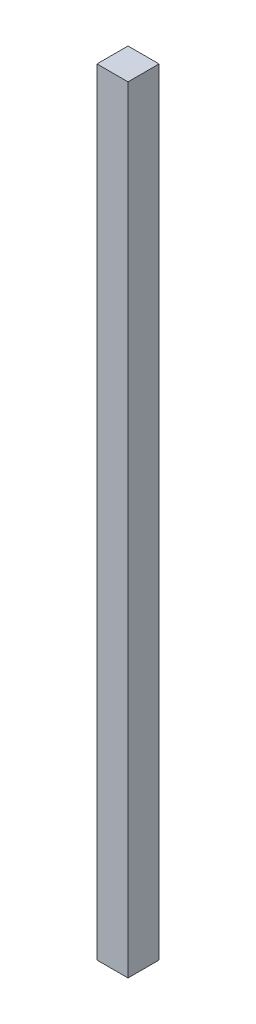
ISO-10303-21;
HEADER;
FILE_DESCRIPTION(('STEP AP214'),'2;1');
FILE_NAME('part.step','',(''),(''),'','','');
FILE_SCHEMA(('AUTOMOTIVE_DESIGN { 1 0 10303 214 1 1 1 1 }'));
ENDSEC;
DATA;
#1=APPLICATION_CONTEXT('core data for automotive mechanical design processes');
#2=APPLICATION_PROTOCOL_DEFINITION('international standard','automotive_design',2000,#1);
#3=PRODUCT_CONTEXT('',#1,'mechanical');
#4=PRODUCT('Part','Part','',(#3));
#5=PRODUCT_RELATED_PRODUCT_CATEGORY('part','',(#4));
#6=PRODUCT_DEFINITION_FORMATION('','',#4);
#7=PRODUCT_DEFINITION_CONTEXT('part definition',#1,'design');
#8=PRODUCT_DEFINITION('design','',#6,#7);
#9=PRODUCT_DEFINITION_SHAPE('','',#8);
#10=(LENGTH_UNIT() NAMED_UNIT(*) SI_UNIT(.MILLI.,.METRE.));
#11=(NAMED_UNIT(*) PLANE_ANGLE_UNIT() SI_UNIT($,.RADIAN.));
#12=(NAMED_UNIT(*) SI_UNIT($,.STERADIAN.) SOLID_ANGLE_UNIT());
#13=UNCERTAINTY_MEASURE_WITH_UNIT(LENGTH_MEASURE(1.E-05),#10,'distance_accuracy_value','');
#14=(GEOMETRIC_REPRESENTATION_CONTEXT(3) GLOBAL_UNCERTAINTY_ASSIGNED_CONTEXT((#13)) GLOBAL_UNIT_ASSIGNED_CONTEXT((#10,
#11,#12)) REPRESENTATION_CONTEXT('',''));
#15=CARTESIAN_POINT('',(0.,0.,0.));
#16=DIRECTION('',(0.,0.,1.));
#17=DIRECTION('',(1.,0.,0.));
#18=AXIS2_PLACEMENT_3D('',#15,#16,#17);
#19=CARTESIAN_POINT('',(10.,500.,-10.));
#20=DIRECTION('',(-1.,0.,0.));
#21=DIRECTION('',(0.,0.,1.));
#22=AXIS2_PLACEMENT_3D('',#19,#20,#21);
#23=PLANE('',#22);
#24=DIRECTION('',(0.,0.,-1.));
#25=VECTOR('',#24,1.);
#26=CARTESIAN_POINT('',(10.,0.,-10.));
#27=LINE('',#26,#25);
#28=CARTESIAN_POINT('',(10.,0.,10.));
#29=VERTEX_POINT('',#28);
#30=CARTESIAN_POINT('',(10.,0.,-10.));
#31=VERTEX_POINT('',#30);
#32=EDGE_CURVE('E107',#29,#31,#27,.T.);
#33=ORIENTED_EDGE('',*,*,#32,.T.);
#34=DIRECTION('',(0.,-1.,0.));
#35=VECTOR('',#34,1.);
#36=CARTESIAN_POINT('',(10.,500.,-10.));
#37=LINE('',#36,#35);
#38=CARTESIAN_POINT('',(10.,500.,-10.));
#39=VERTEX_POINT('',#38);
#40=EDGE_CURVE('E11',#39,#31,#37,.T.);
#41=ORIENTED_EDGE('',*,*,#40,.F.);
#42=DIRECTION('',(0.,0.,-1.));
#43=VECTOR('',#42,1.);
#44=CARTESIAN_POINT('',(10.,500.,-10.));
#45=LINE('',#44,#43);
#46=CARTESIAN_POINT('',(10.,500.,10.));
#47=VERTEX_POINT('',#46);
#48=EDGE_CURVE('E91',#47,#39,#45,.T.);
#49=ORIENTED_EDGE('',*,*,#48,.F.);
#50=DIRECTION('',(0.,-1.,0.));
#51=VECTOR('',#50,1.);
#52=CARTESIAN_POINT('',(10.,500.,10.));
#53=LINE('',#52,#51);
#54=EDGE_CURVE('E103',#47,#29,#53,.T.);
#55=ORIENTED_EDGE('',*,*,#54,.T.);
#56=EDGE_LOOP('',(#33,#41,#49,#55));
#57=FACE_BOUND('',#56,.T.);
#58=ADVANCED_FACE('F39',(#57),#23,.F.);
#59=CARTESIAN_POINT('',(-10.,500.,-10.));
#60=DIRECTION('',(0.,0.,1.));
#61=DIRECTION('',(1.,0.,0.));
#62=AXIS2_PLACEMENT_3D('',#59,#60,#61);
#63=PLANE('',#62);
#64=DIRECTION('',(-1.,0.,0.));
#65=VECTOR('',#64,1.);
#66=CARTESIAN_POINT('',(-10.,0.,-10.));
#67=LINE('',#66,#65);
#68=CARTESIAN_POINT('',(-10.,0.,-10.));
#69=VERTEX_POINT('',#68);
#70=EDGE_CURVE('E96',#31,#69,#67,.T.);
#71=ORIENTED_EDGE('',*,*,#70,.T.);
#72=DIRECTION('',(0.,-1.,0.));
#73=VECTOR('',#72,1.);
#74=CARTESIAN_POINT('',(-10.,500.,-10.));
#75=LINE('',#74,#73);
#76=CARTESIAN_POINT('',(-10.,500.,-10.));
#77=VERTEX_POINT('',#76);
#78=EDGE_CURVE('E48',#77,#69,#75,.T.);
#79=ORIENTED_EDGE('',*,*,#78,.F.);
#80=DIRECTION('',(-1.,0.,0.));
#81=VECTOR('',#80,1.);
#82=CARTESIAN_POINT('',(-10.,500.,-10.));
#83=LINE('',#82,#81);
#84=EDGE_CURVE('E86',#39,#77,#83,.T.);
#85=ORIENTED_EDGE('',*,*,#84,.F.);
#86=ORIENTED_EDGE('',*,*,#40,.T.);
#87=EDGE_LOOP('',(#71,#79,#85,#86));
#88=FACE_BOUND('',#87,.T.);
#89=ADVANCED_FACE('F95',(#88),#63,.F.);
#90=CARTESIAN_POINT('',(-10.,500.,-10.));
#91=DIRECTION('',(1.,0.,0.));
#92=DIRECTION('',(0.,0.,-1.));
#93=AXIS2_PLACEMENT_3D('',#90,#91,#92);
#94=PLANE('',#93);
#95=DIRECTION('',(0.,0.,1.));
#96=VECTOR('',#95,1.);
#97=CARTESIAN_POINT('',(-10.,0.,-10.));
#98=LINE('',#97,#96);
#99=CARTESIAN_POINT('',(-10.,0.,10.));
#100=VERTEX_POINT('',#99);
#101=EDGE_CURVE('E73',#69,#100,#98,.T.);
#102=ORIENTED_EDGE('',*,*,#101,.T.);
#103=DIRECTION('',(0.,-1.,0.));
#104=VECTOR('',#103,1.);
#105=CARTESIAN_POINT('',(-10.,500.,10.));
#106=LINE('',#105,#104);
#107=CARTESIAN_POINT('',(-10.,500.,10.));
#108=VERTEX_POINT('',#107);
#109=EDGE_CURVE('E98',#108,#100,#106,.T.);
#110=ORIENTED_EDGE('',*,*,#109,.F.);
#111=DIRECTION('',(0.,0.,1.));
#112=VECTOR('',#111,1.);
#113=CARTESIAN_POINT('',(-10.,500.,-10.));
#114=LINE('',#113,#112);
#115=EDGE_CURVE('E89',#77,#108,#114,.T.);
#116=ORIENTED_EDGE('',*,*,#115,.F.);
#117=ORIENTED_EDGE('',*,*,#78,.T.);
#118=EDGE_LOOP('',(#102,#110,#116,#117));
#119=FACE_BOUND('',#118,.T.);
#120=ADVANCED_FACE('F99',(#119),#94,.F.);
#121=CARTESIAN_POINT('',(-10.,500.,10.));
#122=DIRECTION('',(0.,0.,-1.));
#123=DIRECTION('',(-1.,0.,0.));
#124=AXIS2_PLACEMENT_3D('',#121,#122,#123);
#125=PLANE('',#124);
#126=DIRECTION('',(1.,0.,0.));
#127=VECTOR('',#126,1.);
#128=CARTESIAN_POINT('',(-10.,0.,10.));
#129=LINE('',#128,#127);
#130=EDGE_CURVE('E79',#100,#29,#129,.T.);
#131=ORIENTED_EDGE('',*,*,#130,.T.);
#132=ORIENTED_EDGE('',*,*,#54,.F.);
#133=DIRECTION('',(1.,0.,0.));
#134=VECTOR('',#133,1.);
#135=CARTESIAN_POINT('',(-10.,500.,10.));
#136=LINE('',#135,#134);
#137=EDGE_CURVE('E56',#108,#47,#136,.T.);
#138=ORIENTED_EDGE('',*,*,#137,.F.);
#139=ORIENTED_EDGE('',*,*,#109,.T.);
#140=EDGE_LOOP('',(#131,#132,#138,#139));
#141=FACE_BOUND('',#140,.T.);
#142=ADVANCED_FACE('F120',(#141),#125,.F.);
#143=CARTESIAN_POINT('',(0.,500.,0.));
#144=DIRECTION('',(0.,1.,0.));
#145=DIRECTION('',(0.,0.,1.));
#146=AXIS2_PLACEMENT_3D('',#143,#144,#145);
#147=PLANE('',#146);
#148=ORIENTED_EDGE('',*,*,#48,.T.);
#149=ORIENTED_EDGE('',*,*,#84,.T.);
#150=ORIENTED_EDGE('',*,*,#115,.T.);
#151=ORIENTED_EDGE('',*,*,#137,.T.);
#152=EDGE_LOOP('',(#148,#149,#150,#151));
#153=FACE_BOUND('',#152,.T.);
#154=ADVANCED_FACE('F87',(#153),#147,.T.);
#155=CARTESIAN_POINT('',(0.,0.,0.));
#156=DIRECTION('',(0.,1.,0.));
#157=DIRECTION('',(0.,0.,1.));
#158=AXIS2_PLACEMENT_3D('',#155,#156,#157);
#159=PLANE('',#158);
#160=ORIENTED_EDGE('',*,*,#32,.F.);
#161=ORIENTED_EDGE('',*,*,#130,.F.);
#162=ORIENTED_EDGE('',*,*,#101,.F.);
#163=ORIENTED_EDGE('',*,*,#70,.F.);
#164=EDGE_LOOP('',(#160,#161,#162,#163));
#165=FACE_BOUND('',#164,.T.);
#166=ADVANCED_FACE('F123',(#165),#159,.F.);
#167=CLOSED_SHELL('',(#58,#89,#120,#142,#154,#166));
#168=MANIFOLD_SOLID_BREP('B2',#167);
#169=ADVANCED_BREP_SHAPE_REPRESENTATION('',(#18,#168),#14);
#170=SHAPE_DEFINITION_REPRESENTATION(#9,#169);
ENDSEC;
END-ISO-10303-21;
